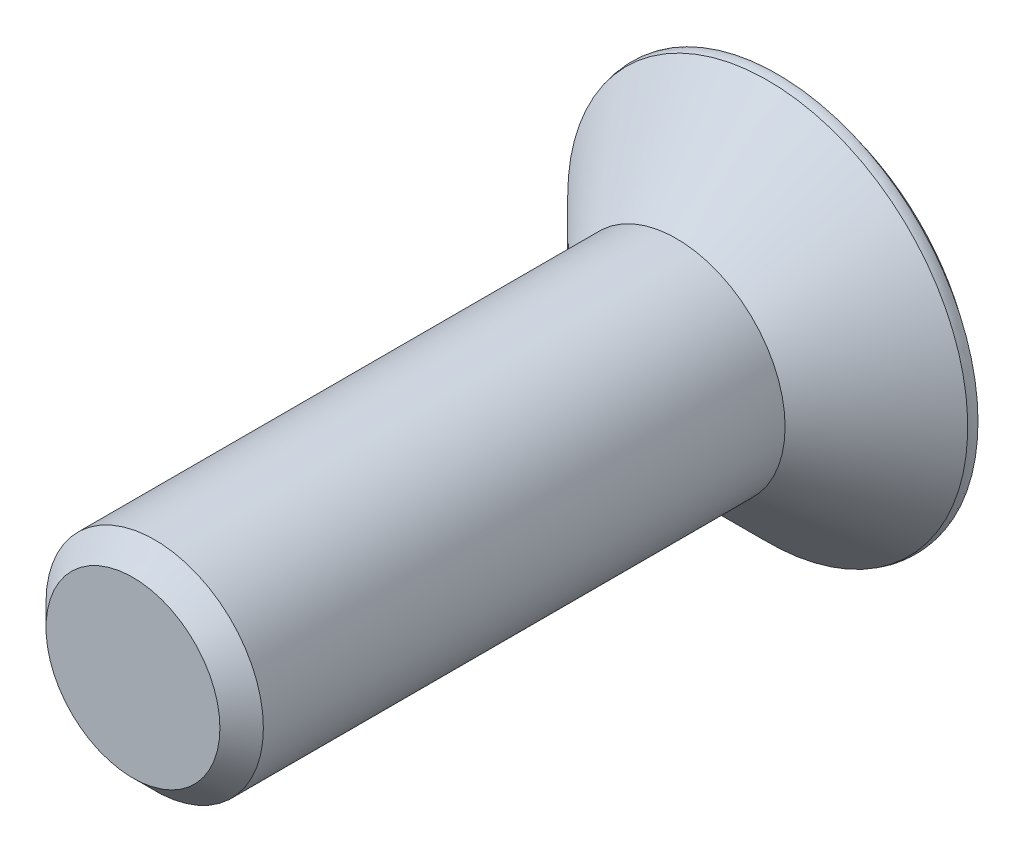
ISO-10303-21;
HEADER;
FILE_DESCRIPTION(('STEP AP214'),'2;1');
FILE_NAME('part.step','',(''),(''),'','','');
FILE_SCHEMA(('AUTOMOTIVE_DESIGN { 1 0 10303 214 1 1 1 1 }'));
ENDSEC;
DATA;
#1=APPLICATION_CONTEXT('core data for automotive mechanical design processes');
#2=APPLICATION_PROTOCOL_DEFINITION('international standard','automotive_design',2000,#1);
#3=PRODUCT_CONTEXT('',#1,'mechanical');
#4=PRODUCT('Part','Part','',(#3));
#5=PRODUCT_RELATED_PRODUCT_CATEGORY('part','',(#4));
#6=PRODUCT_DEFINITION_FORMATION('','',#4);
#7=PRODUCT_DEFINITION_CONTEXT('part definition',#1,'design');
#8=PRODUCT_DEFINITION('design','',#6,#7);
#9=PRODUCT_DEFINITION_SHAPE('','',#8);
#10=(LENGTH_UNIT() NAMED_UNIT(*) SI_UNIT(.MILLI.,.METRE.));
#11=(NAMED_UNIT(*) PLANE_ANGLE_UNIT() SI_UNIT($,.RADIAN.));
#12=(NAMED_UNIT(*) SI_UNIT($,.STERADIAN.) SOLID_ANGLE_UNIT());
#13=UNCERTAINTY_MEASURE_WITH_UNIT(LENGTH_MEASURE(1.E-05),#10,'distance_accuracy_value','');
#14=(GEOMETRIC_REPRESENTATION_CONTEXT(3) GLOBAL_UNCERTAINTY_ASSIGNED_CONTEXT((#13)) GLOBAL_UNIT_ASSIGNED_CONTEXT((#10,
#11,#12)) REPRESENTATION_CONTEXT('',''));
#15=CARTESIAN_POINT('',(0.,0.,0.));
#16=DIRECTION('',(0.,0.,1.));
#17=DIRECTION('',(1.,0.,0.));
#18=AXIS2_PLACEMENT_3D('',#15,#16,#17);
#19=CARTESIAN_POINT('',(0.,0.,2.68161031138519));
#20=DIRECTION('',(0.,0.,-1.));
#21=DIRECTION('',(1.,0.,0.));
#22=AXIS2_PLACEMENT_3D('',#19,#20,#21);
#23=SPHERICAL_SURFACE('',#22,5.85117805403074);
#24=CARTESIAN_POINT('',(0.,0.,-1.85809767217837));
#25=DIRECTION('',(0.,0.,-1.));
#26=DIRECTION('',(-1.,0.,0.));
#27=AXIS2_PLACEMENT_3D('',#24,#25,#26);
#28=CIRCLE('',#27,3.69152218521576);
#29=CARTESIAN_POINT('',(-3.69152218521576,0.,-1.85809767217837));
#30=VERTEX_POINT('',#29);
#31=EDGE_CURVE('E131',#30,#30,#28,.T.);
#32=ORIENTED_EDGE('',*,*,#31,.T.);
#33=EDGE_LOOP('',(#32));
#34=FACE_BOUND('',#33,.T.);
#35=CARTESIAN_POINT('',(-2.35,0.,2.68161031138519));
#36=DIRECTION('',(1.,0.,0.));
#37=DIRECTION('',(0.,0.,-1.));
#38=AXIS2_PLACEMENT_3D('',#35,#36,#37);
#39=CIRCLE('',#38,5.358524481606);
#40=CARTESIAN_POINT('',(-2.35,-0.6,-2.64321688017426));
#41=VERTEX_POINT('',#40);
#42=CARTESIAN_POINT('',(-2.35,0.6,-2.64321688017426));
#43=VERTEX_POINT('',#42);
#44=EDGE_CURVE('E230',#41,#43,#39,.T.);
#45=ORIENTED_EDGE('',*,*,#44,.F.);
#46=CARTESIAN_POINT('',(0.,-0.6,2.68161031138519));
#47=DIRECTION('',(0.,1.,0.));
#48=DIRECTION('',(-1.,0.,0.));
#49=AXIS2_PLACEMENT_3D('',#46,#47,#48);
#50=CIRCLE('',#49,5.82033372067022);
#51=CARTESIAN_POINT('',(-0.6,-0.6,-3.10771474599161));
#52=VERTEX_POINT('',#51);
#53=EDGE_CURVE('E58',#52,#41,#50,.T.);
#54=ORIENTED_EDGE('',*,*,#53,.F.);
#55=CARTESIAN_POINT('',(-0.6,0.,2.68161031138519));
#56=DIRECTION('',(1.,0.,0.));
#57=DIRECTION('',(0.,1.,0.));
#58=AXIS2_PLACEMENT_3D('',#55,#56,#57);
#59=CIRCLE('',#58,5.82033372067022);
#60=CARTESIAN_POINT('',(-0.6,-2.35,-2.64321688017426));
#61=VERTEX_POINT('',#60);
#62=EDGE_CURVE('E227',#61,#52,#59,.T.);
#63=ORIENTED_EDGE('',*,*,#62,.F.);
#64=CARTESIAN_POINT('',(0.,-2.35,2.68161031138519));
#65=DIRECTION('',(0.,1.,0.));
#66=DIRECTION('',(0.,0.,1.));
#67=AXIS2_PLACEMENT_3D('',#64,#65,#66);
#68=CIRCLE('',#67,5.358524481606);
#69=CARTESIAN_POINT('',(0.6,-2.35,-2.64321688017426));
#70=VERTEX_POINT('',#69);
#71=EDGE_CURVE('E225',#70,#61,#68,.T.);
#72=ORIENTED_EDGE('',*,*,#71,.F.);
#73=CARTESIAN_POINT('',(0.6,0.,2.68161031138519));
#74=DIRECTION('',(-1.,0.,0.));
#75=DIRECTION('',(0.,-1.,0.));
#76=AXIS2_PLACEMENT_3D('',#73,#74,#75);
#77=CIRCLE('',#76,5.82033372067022);
#78=CARTESIAN_POINT('',(0.6,-0.6,-3.10771474599161));
#79=VERTEX_POINT('',#78);
#80=EDGE_CURVE('E223',#79,#70,#77,.T.);
#81=ORIENTED_EDGE('',*,*,#80,.F.);
#82=CARTESIAN_POINT('',(0.,-0.6,2.68161031138519));
#83=DIRECTION('',(0.,1.,0.));
#84=DIRECTION('',(-1.,0.,0.));
#85=AXIS2_PLACEMENT_3D('',#82,#83,#84);
#86=CIRCLE('',#85,5.82033372067022);
#87=CARTESIAN_POINT('',(2.35,-0.6,-2.64321688017426));
#88=VERTEX_POINT('',#87);
#89=EDGE_CURVE('E221',#88,#79,#86,.T.);
#90=ORIENTED_EDGE('',*,*,#89,.F.);
#91=CARTESIAN_POINT('',(2.35,0.,2.68161031138519));
#92=DIRECTION('',(-1.,0.,0.));
#93=DIRECTION('',(0.,-1.,0.));
#94=AXIS2_PLACEMENT_3D('',#91,#92,#93);
#95=CIRCLE('',#94,5.358524481606);
#96=CARTESIAN_POINT('',(2.35,0.6,-2.64321688017426));
#97=VERTEX_POINT('',#96);
#98=EDGE_CURVE('E219',#97,#88,#95,.T.);
#99=ORIENTED_EDGE('',*,*,#98,.F.);
#100=CARTESIAN_POINT('',(0.,0.6,2.68161031138519));
#101=DIRECTION('',(0.,-1.,0.));
#102=DIRECTION('',(1.,0.,0.));
#103=AXIS2_PLACEMENT_3D('',#100,#101,#102);
#104=CIRCLE('',#103,5.82033372067022);
#105=CARTESIAN_POINT('',(0.6,0.6,-3.10771474599161));
#106=VERTEX_POINT('',#105);
#107=EDGE_CURVE('E217',#106,#97,#104,.T.);
#108=ORIENTED_EDGE('',*,*,#107,.F.);
#109=CARTESIAN_POINT('',(0.6,0.,2.68161031138519));
#110=DIRECTION('',(-1.,0.,0.));
#111=DIRECTION('',(0.,-1.,0.));
#112=AXIS2_PLACEMENT_3D('',#109,#110,#111);
#113=CIRCLE('',#112,5.82033372067022);
#114=CARTESIAN_POINT('',(0.6,2.35,-2.64321688017426));
#115=VERTEX_POINT('',#114);
#116=EDGE_CURVE('E215',#115,#106,#113,.T.);
#117=ORIENTED_EDGE('',*,*,#116,.F.);
#118=CARTESIAN_POINT('',(0.,2.35,2.68161031138519));
#119=DIRECTION('',(0.,-1.,0.));
#120=DIRECTION('',(0.,0.,-1.));
#121=AXIS2_PLACEMENT_3D('',#118,#119,#120);
#122=CIRCLE('',#121,5.358524481606);
#123=CARTESIAN_POINT('',(-0.6,2.35,-2.64321688017426));
#124=VERTEX_POINT('',#123);
#125=EDGE_CURVE('E213',#124,#115,#122,.T.);
#126=ORIENTED_EDGE('',*,*,#125,.F.);
#127=CARTESIAN_POINT('',(-0.6,0.,2.68161031138519));
#128=DIRECTION('',(1.,0.,0.));
#129=DIRECTION('',(0.,1.,0.));
#130=AXIS2_PLACEMENT_3D('',#127,#128,#129);
#131=CIRCLE('',#130,5.82033372067022);
#132=CARTESIAN_POINT('',(-0.6,0.6,-3.10771474599161));
#133=VERTEX_POINT('',#132);
#134=EDGE_CURVE('E211',#133,#124,#131,.T.);
#135=ORIENTED_EDGE('',*,*,#134,.F.);
#136=CARTESIAN_POINT('',(0.,0.6,2.68161031138519));
#137=DIRECTION('',(0.,-1.,0.));
#138=DIRECTION('',(1.,0.,0.));
#139=AXIS2_PLACEMENT_3D('',#136,#137,#138);
#140=CIRCLE('',#139,5.82033372067022);
#141=EDGE_CURVE('E209',#43,#133,#140,.T.);
#142=ORIENTED_EDGE('',*,*,#141,.F.);
#143=EDGE_LOOP('',(#45,#54,#63,#72,#81,#90,#99,#108,#117,#126,#135,#142));
#144=FACE_BOUND('',#143,.T.);
#145=ADVANCED_FACE('F35',(#34,#144),#23,.T.);
#146=CARTESIAN_POINT('',(0.,0.,0.));
#147=DIRECTION('',(0.,0.,-1.));
#148=DIRECTION('',(-1.,0.,0.));
#149=AXIS2_PLACEMENT_3D('',#146,#147,#148);
#150=CONICAL_SURFACE('',#149,2.,0.785398163397454);
#151=CARTESIAN_POINT('',(0.,0.,-1.68026160925435));
#152=DIRECTION('',(0.,0.,-1.));
#153=DIRECTION('',(-1.,0.,0.));
#154=AXIS2_PLACEMENT_3D('',#151,#152,#153);
#155=CIRCLE('',#154,3.68026160925437);
#156=CARTESIAN_POINT('',(-3.68026160925437,0.,-1.68026160925435));
#157=VERTEX_POINT('',#156);
#158=EDGE_CURVE('E206',#157,#157,#155,.T.);
#159=ORIENTED_EDGE('',*,*,#158,.F.);
#160=EDGE_LOOP('',(#159));
#161=FACE_BOUND('',#160,.T.);
#162=CARTESIAN_POINT('',(0.,0.,0.));
#163=DIRECTION('',(0.,0.,1.));
#164=DIRECTION('',(1.,0.,0.));
#165=AXIS2_PLACEMENT_3D('',#162,#163,#164);
#166=CIRCLE('',#165,2.);
#167=CARTESIAN_POINT('',(2.,0.,0.));
#168=VERTEX_POINT('',#167);
#169=EDGE_CURVE('E172',#168,#168,#166,.T.);
#170=ORIENTED_EDGE('',*,*,#169,.F.);
#171=EDGE_LOOP('',(#170));
#172=FACE_BOUND('',#171,.T.);
#173=ADVANCED_FACE('F248',(#161,#172),#150,.T.);
#174=CARTESIAN_POINT('',(0.,0.,-1.78728230995357));
#175=DIRECTION('',(0.,0.,-1.));
#176=DIRECTION('',(-1.,0.,0.));
#177=AXIS2_PLACEMENT_3D('',#174,#175,#176);
#178=TOROIDAL_SURFACE('',#177,3.4,0.300000000000001);
#179=ORIENTED_EDGE('',*,*,#31,.F.);
#180=EDGE_LOOP('',(#179));
#181=FACE_BOUND('',#180,.T.);
#182=ORIENTED_EDGE('',*,*,#158,.T.);
#183=EDGE_LOOP('',(#182));
#184=FACE_BOUND('',#183,.T.);
#185=ADVANCED_FACE('F254',(#181,#184),#178,.T.);
#186=CARTESIAN_POINT('',(-2.35,0.6,-2.1));
#187=DIRECTION('',(1.,0.,0.));
#188=DIRECTION('',(0.,0.,-1.));
#189=AXIS2_PLACEMENT_3D('',#186,#187,#188);
#190=PLANE('',#189);
#191=ORIENTED_EDGE('',*,*,#44,.T.);
#192=DIRECTION('',(0.,0.,-1.));
#193=VECTOR('',#192,1.);
#194=CARTESIAN_POINT('',(-2.35,0.6,-2.1));
#195=LINE('',#194,#193);
#196=CARTESIAN_POINT('',(-2.35,0.6,-1.1));
#197=VERTEX_POINT('',#196);
#198=EDGE_CURVE('E50',#197,#43,#195,.T.);
#199=ORIENTED_EDGE('',*,*,#198,.F.);
#200=DIRECTION('',(0.,1.,0.));
#201=VECTOR('',#200,1.);
#202=CARTESIAN_POINT('',(-2.35,-0.6,-1.1));
#203=LINE('',#202,#201);
#204=CARTESIAN_POINT('',(-2.35,-0.6,-1.1));
#205=VERTEX_POINT('',#204);
#206=EDGE_CURVE('E135',#205,#197,#203,.T.);
#207=ORIENTED_EDGE('',*,*,#206,.F.);
#208=DIRECTION('',(0.,0.,-1.));
#209=VECTOR('',#208,1.);
#210=CARTESIAN_POINT('',(-2.35,-0.6,-2.1));
#211=LINE('',#210,#209);
#212=EDGE_CURVE('E123',#205,#41,#211,.T.);
#213=ORIENTED_EDGE('',*,*,#212,.T.);
#214=EDGE_LOOP('',(#191,#199,#207,#213));
#215=FACE_BOUND('',#214,.T.);
#216=ADVANCED_FACE('F136',(#215),#190,.T.);
#217=CARTESIAN_POINT('',(-2.35,-0.6,-2.1));
#218=DIRECTION('',(0.,1.,0.));
#219=DIRECTION('',(-1.,0.,0.));
#220=AXIS2_PLACEMENT_3D('',#217,#218,#219);
#221=PLANE('',#220);
#222=ORIENTED_EDGE('',*,*,#53,.T.);
#223=ORIENTED_EDGE('',*,*,#212,.F.);
#224=DIRECTION('',(-1.,0.,0.));
#225=VECTOR('',#224,1.);
#226=CARTESIAN_POINT('',(-0.6,-0.6,-1.1));
#227=LINE('',#226,#225);
#228=CARTESIAN_POINT('',(-0.6,-0.6,-1.1));
#229=VERTEX_POINT('',#228);
#230=EDGE_CURVE('E127',#229,#205,#227,.T.);
#231=ORIENTED_EDGE('',*,*,#230,.F.);
#232=DIRECTION('',(0.,0.,-1.));
#233=VECTOR('',#232,1.);
#234=CARTESIAN_POINT('',(-0.6,-0.6,-2.1));
#235=LINE('',#234,#233);
#236=EDGE_CURVE('E132',#229,#52,#235,.T.);
#237=ORIENTED_EDGE('',*,*,#236,.T.);
#238=EDGE_LOOP('',(#222,#223,#231,#237));
#239=FACE_BOUND('',#238,.T.);
#240=ADVANCED_FACE('F125',(#239),#221,.T.);
#241=CARTESIAN_POINT('',(-0.6,-0.6,-2.1));
#242=DIRECTION('',(1.,0.,0.));
#243=DIRECTION('',(0.,1.,0.));
#244=AXIS2_PLACEMENT_3D('',#241,#242,#243);
#245=PLANE('',#244);
#246=ORIENTED_EDGE('',*,*,#62,.T.);
#247=ORIENTED_EDGE('',*,*,#236,.F.);
#248=DIRECTION('',(0.,1.,0.));
#249=VECTOR('',#248,1.);
#250=CARTESIAN_POINT('',(-0.6,-2.35,-1.1));
#251=LINE('',#250,#249);
#252=CARTESIAN_POINT('',(-0.6,-2.35,-1.1));
#253=VERTEX_POINT('',#252);
#254=EDGE_CURVE('E144',#253,#229,#251,.T.);
#255=ORIENTED_EDGE('',*,*,#254,.F.);
#256=DIRECTION('',(0.,0.,-1.));
#257=VECTOR('',#256,1.);
#258=CARTESIAN_POINT('',(-0.6,-2.35,-2.1));
#259=LINE('',#258,#257);
#260=EDGE_CURVE('E200',#253,#61,#259,.T.);
#261=ORIENTED_EDGE('',*,*,#260,.T.);
#262=EDGE_LOOP('',(#246,#247,#255,#261));
#263=FACE_BOUND('',#262,.T.);
#264=ADVANCED_FACE('F274',(#263),#245,.T.);
#265=CARTESIAN_POINT('',(-0.6,-2.35,-2.1));
#266=DIRECTION('',(0.,1.,0.));
#267=DIRECTION('',(0.,0.,1.));
#268=AXIS2_PLACEMENT_3D('',#265,#266,#267);
#269=PLANE('',#268);
#270=ORIENTED_EDGE('',*,*,#71,.T.);
#271=ORIENTED_EDGE('',*,*,#260,.F.);
#272=DIRECTION('',(-1.,0.,0.));
#273=VECTOR('',#272,1.);
#274=CARTESIAN_POINT('',(0.6,-2.35,-1.1));
#275=LINE('',#274,#273);
#276=CARTESIAN_POINT('',(0.6,-2.35,-1.1));
#277=VERTEX_POINT('',#276);
#278=EDGE_CURVE('E169',#277,#253,#275,.T.);
#279=ORIENTED_EDGE('',*,*,#278,.F.);
#280=DIRECTION('',(0.,0.,-1.));
#281=VECTOR('',#280,1.);
#282=CARTESIAN_POINT('',(0.6,-2.35,-2.1));
#283=LINE('',#282,#281);
#284=EDGE_CURVE('E197',#277,#70,#283,.T.);
#285=ORIENTED_EDGE('',*,*,#284,.T.);
#286=EDGE_LOOP('',(#270,#271,#279,#285));
#287=FACE_BOUND('',#286,.T.);
#288=ADVANCED_FACE('F278',(#287),#269,.T.);
#289=CARTESIAN_POINT('',(0.6,-0.6,-2.1));
#290=DIRECTION('',(-1.,0.,0.));
#291=DIRECTION('',(0.,-1.,0.));
#292=AXIS2_PLACEMENT_3D('',#289,#290,#291);
#293=PLANE('',#292);
#294=ORIENTED_EDGE('',*,*,#80,.T.);
#295=ORIENTED_EDGE('',*,*,#284,.F.);
#296=DIRECTION('',(0.,-1.,0.));
#297=VECTOR('',#296,1.);
#298=CARTESIAN_POINT('',(0.6,-0.6,-1.1));
#299=LINE('',#298,#297);
#300=CARTESIAN_POINT('',(0.6,-0.6,-1.1));
#301=VERTEX_POINT('',#300);
#302=EDGE_CURVE('E166',#301,#277,#299,.T.);
#303=ORIENTED_EDGE('',*,*,#302,.F.);
#304=DIRECTION('',(0.,0.,-1.));
#305=VECTOR('',#304,1.);
#306=CARTESIAN_POINT('',(0.6,-0.6,-2.1));
#307=LINE('',#306,#305);
#308=EDGE_CURVE('E194',#301,#79,#307,.T.);
#309=ORIENTED_EDGE('',*,*,#308,.T.);
#310=EDGE_LOOP('',(#294,#295,#303,#309));
#311=FACE_BOUND('',#310,.T.);
#312=ADVANCED_FACE('F284',(#311),#293,.T.);
#313=CARTESIAN_POINT('',(0.6,-0.6,-2.1));
#314=DIRECTION('',(0.,1.,0.));
#315=DIRECTION('',(-1.,0.,0.));
#316=AXIS2_PLACEMENT_3D('',#313,#314,#315);
#317=PLANE('',#316);
#318=ORIENTED_EDGE('',*,*,#89,.T.);
#319=ORIENTED_EDGE('',*,*,#308,.F.);
#320=DIRECTION('',(-1.,0.,0.));
#321=VECTOR('',#320,1.);
#322=CARTESIAN_POINT('',(2.35,-0.6,-1.1));
#323=LINE('',#322,#321);
#324=CARTESIAN_POINT('',(2.35,-0.6,-1.1));
#325=VERTEX_POINT('',#324);
#326=EDGE_CURVE('E163',#325,#301,#323,.T.);
#327=ORIENTED_EDGE('',*,*,#326,.F.);
#328=DIRECTION('',(0.,0.,-1.));
#329=VECTOR('',#328,1.);
#330=CARTESIAN_POINT('',(2.35,-0.6,-2.1));
#331=LINE('',#330,#329);
#332=EDGE_CURVE('E191',#325,#88,#331,.T.);
#333=ORIENTED_EDGE('',*,*,#332,.T.);
#334=EDGE_LOOP('',(#318,#319,#327,#333));
#335=FACE_BOUND('',#334,.T.);
#336=ADVANCED_FACE('F288',(#335),#317,.T.);
#337=CARTESIAN_POINT('',(2.35,0.6,-2.1));
#338=DIRECTION('',(-1.,0.,0.));
#339=DIRECTION('',(0.,-1.,0.));
#340=AXIS2_PLACEMENT_3D('',#337,#338,#339);
#341=PLANE('',#340);
#342=ORIENTED_EDGE('',*,*,#98,.T.);
#343=ORIENTED_EDGE('',*,*,#332,.F.);
#344=DIRECTION('',(0.,-1.,0.));
#345=VECTOR('',#344,1.);
#346=CARTESIAN_POINT('',(2.35,0.6,-1.1));
#347=LINE('',#346,#345);
#348=CARTESIAN_POINT('',(2.35,0.6,-1.1));
#349=VERTEX_POINT('',#348);
#350=EDGE_CURVE('E160',#349,#325,#347,.T.);
#351=ORIENTED_EDGE('',*,*,#350,.F.);
#352=DIRECTION('',(0.,0.,-1.));
#353=VECTOR('',#352,1.);
#354=CARTESIAN_POINT('',(2.35,0.6,-2.1));
#355=LINE('',#354,#353);
#356=EDGE_CURVE('E188',#349,#97,#355,.T.);
#357=ORIENTED_EDGE('',*,*,#356,.T.);
#358=EDGE_LOOP('',(#342,#343,#351,#357));
#359=FACE_BOUND('',#358,.T.);
#360=ADVANCED_FACE('F292',(#359),#341,.T.);
#361=CARTESIAN_POINT('',(0.6,0.6,-2.1));
#362=DIRECTION('',(0.,-1.,0.));
#363=DIRECTION('',(1.,0.,0.));
#364=AXIS2_PLACEMENT_3D('',#361,#362,#363);
#365=PLANE('',#364);
#366=ORIENTED_EDGE('',*,*,#107,.T.);
#367=ORIENTED_EDGE('',*,*,#356,.F.);
#368=DIRECTION('',(1.,0.,0.));
#369=VECTOR('',#368,1.);
#370=CARTESIAN_POINT('',(0.6,0.6,-1.1));
#371=LINE('',#370,#369);
#372=CARTESIAN_POINT('',(0.6,0.6,-1.1));
#373=VERTEX_POINT('',#372);
#374=EDGE_CURVE('E157',#373,#349,#371,.T.);
#375=ORIENTED_EDGE('',*,*,#374,.F.);
#376=DIRECTION('',(0.,0.,-1.));
#377=VECTOR('',#376,1.);
#378=CARTESIAN_POINT('',(0.6,0.6,-2.1));
#379=LINE('',#378,#377);
#380=EDGE_CURVE('E185',#373,#106,#379,.T.);
#381=ORIENTED_EDGE('',*,*,#380,.T.);
#382=EDGE_LOOP('',(#366,#367,#375,#381));
#383=FACE_BOUND('',#382,.T.);
#384=ADVANCED_FACE('F296',(#383),#365,.T.);
#385=CARTESIAN_POINT('',(0.6,2.35,-2.1));
#386=DIRECTION('',(-1.,0.,0.));
#387=DIRECTION('',(0.,-1.,0.));
#388=AXIS2_PLACEMENT_3D('',#385,#386,#387);
#389=PLANE('',#388);
#390=ORIENTED_EDGE('',*,*,#116,.T.);
#391=ORIENTED_EDGE('',*,*,#380,.F.);
#392=DIRECTION('',(0.,-1.,0.));
#393=VECTOR('',#392,1.);
#394=CARTESIAN_POINT('',(0.6,2.35,-1.1));
#395=LINE('',#394,#393);
#396=CARTESIAN_POINT('',(0.6,2.35,-1.1));
#397=VERTEX_POINT('',#396);
#398=EDGE_CURVE('E154',#397,#373,#395,.T.);
#399=ORIENTED_EDGE('',*,*,#398,.F.);
#400=DIRECTION('',(0.,0.,-1.));
#401=VECTOR('',#400,1.);
#402=CARTESIAN_POINT('',(0.6,2.35,-2.1));
#403=LINE('',#402,#401);
#404=EDGE_CURVE('E182',#397,#115,#403,.T.);
#405=ORIENTED_EDGE('',*,*,#404,.T.);
#406=EDGE_LOOP('',(#390,#391,#399,#405));
#407=FACE_BOUND('',#406,.T.);
#408=ADVANCED_FACE('F300',(#407),#389,.T.);
#409=CARTESIAN_POINT('',(-0.6,2.35,-2.1));
#410=DIRECTION('',(0.,-1.,0.));
#411=DIRECTION('',(0.,0.,-1.));
#412=AXIS2_PLACEMENT_3D('',#409,#410,#411);
#413=PLANE('',#412);
#414=ORIENTED_EDGE('',*,*,#125,.T.);
#415=ORIENTED_EDGE('',*,*,#404,.F.);
#416=DIRECTION('',(1.,0.,0.));
#417=VECTOR('',#416,1.);
#418=CARTESIAN_POINT('',(-0.6,2.35,-1.1));
#419=LINE('',#418,#417);
#420=CARTESIAN_POINT('',(-0.6,2.35,-1.1));
#421=VERTEX_POINT('',#420);
#422=EDGE_CURVE('E151',#421,#397,#419,.T.);
#423=ORIENTED_EDGE('',*,*,#422,.F.);
#424=DIRECTION('',(0.,0.,-1.));
#425=VECTOR('',#424,1.);
#426=CARTESIAN_POINT('',(-0.6,2.35,-2.1));
#427=LINE('',#426,#425);
#428=EDGE_CURVE('E179',#421,#124,#427,.T.);
#429=ORIENTED_EDGE('',*,*,#428,.T.);
#430=EDGE_LOOP('',(#414,#415,#423,#429));
#431=FACE_BOUND('',#430,.T.);
#432=ADVANCED_FACE('F304',(#431),#413,.T.);
#433=CARTESIAN_POINT('',(-0.6,2.35,-2.1));
#434=DIRECTION('',(1.,0.,0.));
#435=DIRECTION('',(0.,1.,0.));
#436=AXIS2_PLACEMENT_3D('',#433,#434,#435);
#437=PLANE('',#436);
#438=ORIENTED_EDGE('',*,*,#134,.T.);
#439=ORIENTED_EDGE('',*,*,#428,.F.);
#440=DIRECTION('',(0.,1.,0.));
#441=VECTOR('',#440,1.);
#442=CARTESIAN_POINT('',(-0.6,0.6,-1.1));
#443=LINE('',#442,#441);
#444=CARTESIAN_POINT('',(-0.6,0.6,-1.1));
#445=VERTEX_POINT('',#444);
#446=EDGE_CURVE('E148',#445,#421,#443,.T.);
#447=ORIENTED_EDGE('',*,*,#446,.F.);
#448=DIRECTION('',(0.,0.,-1.));
#449=VECTOR('',#448,1.);
#450=CARTESIAN_POINT('',(-0.6,0.6,-2.1));
#451=LINE('',#450,#449);
#452=EDGE_CURVE('E176',#445,#133,#451,.T.);
#453=ORIENTED_EDGE('',*,*,#452,.T.);
#454=EDGE_LOOP('',(#438,#439,#447,#453));
#455=FACE_BOUND('',#454,.T.);
#456=ADVANCED_FACE('F308',(#455),#437,.T.);
#457=CARTESIAN_POINT('',(-2.35,0.6,-2.1));
#458=DIRECTION('',(0.,-1.,0.));
#459=DIRECTION('',(1.,0.,0.));
#460=AXIS2_PLACEMENT_3D('',#457,#458,#459);
#461=PLANE('',#460);
#462=ORIENTED_EDGE('',*,*,#141,.T.);
#463=ORIENTED_EDGE('',*,*,#452,.F.);
#464=DIRECTION('',(1.,0.,0.));
#465=VECTOR('',#464,1.);
#466=CARTESIAN_POINT('',(-2.35,0.6,-1.1));
#467=LINE('',#466,#465);
#468=EDGE_CURVE('E139',#197,#445,#467,.T.);
#469=ORIENTED_EDGE('',*,*,#468,.F.);
#470=ORIENTED_EDGE('',*,*,#198,.T.);
#471=EDGE_LOOP('',(#462,#463,#469,#470));
#472=FACE_BOUND('',#471,.T.);
#473=ADVANCED_FACE('F312',(#472),#461,.T.);
#474=CARTESIAN_POINT('',(0.,0.,10.));
#475=DIRECTION('',(0.,0.,1.));
#476=DIRECTION('',(1.,0.,0.));
#477=AXIS2_PLACEMENT_3D('',#474,#475,#476);
#478=PLANE('',#477);
#479=CARTESIAN_POINT('',(0.,0.,10.));
#480=DIRECTION('',(0.,0.,1.));
#481=DIRECTION('',(1.,0.,0.));
#482=AXIS2_PLACEMENT_3D('',#479,#480,#481);
#483=CIRCLE('',#482,1.6);
#484=CARTESIAN_POINT('',(1.6,0.,10.));
#485=VERTEX_POINT('',#484);
#486=EDGE_CURVE('E43',#485,#485,#483,.T.);
#487=ORIENTED_EDGE('',*,*,#486,.T.);
#488=EDGE_LOOP('',(#487));
#489=FACE_BOUND('',#488,.T.);
#490=ADVANCED_FACE('F234',(#489),#478,.T.);
#491=CARTESIAN_POINT('',(0.,0.,0.));
#492=DIRECTION('',(0.,0.,1.));
#493=DIRECTION('',(1.,0.,0.));
#494=AXIS2_PLACEMENT_3D('',#491,#492,#493);
#495=CYLINDRICAL_SURFACE('',#494,2.);
#496=CARTESIAN_POINT('',(0.,0.,9.6));
#497=DIRECTION('',(0.,0.,1.));
#498=DIRECTION('',(1.,0.,0.));
#499=AXIS2_PLACEMENT_3D('',#496,#497,#498);
#500=CIRCLE('',#499,2.);
#501=CARTESIAN_POINT('',(2.,0.,9.6));
#502=VERTEX_POINT('',#501);
#503=EDGE_CURVE('E11',#502,#502,#500,.F.);
#504=ORIENTED_EDGE('',*,*,#503,.T.);
#505=EDGE_LOOP('',(#504));
#506=FACE_BOUND('',#505,.T.);
#507=ORIENTED_EDGE('',*,*,#169,.T.);
#508=EDGE_LOOP('',(#507));
#509=FACE_BOUND('',#508,.T.);
#510=ADVANCED_FACE('F237',(#506,#509),#495,.T.);
#511=CARTESIAN_POINT('',(0.,0.,10.));
#512=DIRECTION('',(0.,0.,-1.));
#513=DIRECTION('',(-1.,0.,0.));
#514=AXIS2_PLACEMENT_3D('',#511,#512,#513);
#515=CONICAL_SURFACE('',#514,1.6,0.785398163397446);
#516=ORIENTED_EDGE('',*,*,#503,.F.);
#517=EDGE_LOOP('',(#516));
#518=FACE_BOUND('',#517,.T.);
#519=ORIENTED_EDGE('',*,*,#486,.F.);
#520=EDGE_LOOP('',(#519));
#521=FACE_BOUND('',#520,.T.);
#522=ADVANCED_FACE('F37',(#518,#521),#515,.T.);
#523=CARTESIAN_POINT('',(0.6,-0.6,-1.1));
#524=DIRECTION('',(0.,0.,1.));
#525=DIRECTION('',(1.,0.,0.));
#526=AXIS2_PLACEMENT_3D('',#523,#524,#525);
#527=PLANE('',#526);
#528=ORIENTED_EDGE('',*,*,#230,.T.);
#529=ORIENTED_EDGE('',*,*,#206,.T.);
#530=ORIENTED_EDGE('',*,*,#468,.T.);
#531=ORIENTED_EDGE('',*,*,#446,.T.);
#532=ORIENTED_EDGE('',*,*,#422,.T.);
#533=ORIENTED_EDGE('',*,*,#398,.T.);
#534=ORIENTED_EDGE('',*,*,#374,.T.);
#535=ORIENTED_EDGE('',*,*,#350,.T.);
#536=ORIENTED_EDGE('',*,*,#326,.T.);
#537=ORIENTED_EDGE('',*,*,#302,.T.);
#538=ORIENTED_EDGE('',*,*,#278,.T.);
#539=ORIENTED_EDGE('',*,*,#254,.T.);
#540=EDGE_LOOP('',(#528,#529,#530,#531,#532,#533,#534,#535,#536,#537,#538,#539));
#541=FACE_BOUND('',#540,.T.);
#542=ADVANCED_FACE('F141',(#541),#527,.F.);
#543=CLOSED_SHELL('',(#145,#173,#185,#216,#240,#264,#288,#312,#336,#360,#384,#408,#432,#456,
#473,#490,#510,#522,#542));
#544=MANIFOLD_SOLID_BREP('B2',#543);
#545=ADVANCED_BREP_SHAPE_REPRESENTATION('',(#18,#544),#14);
#546=SHAPE_DEFINITION_REPRESENTATION(#9,#545);
ENDSEC;
END-ISO-10303-21;
